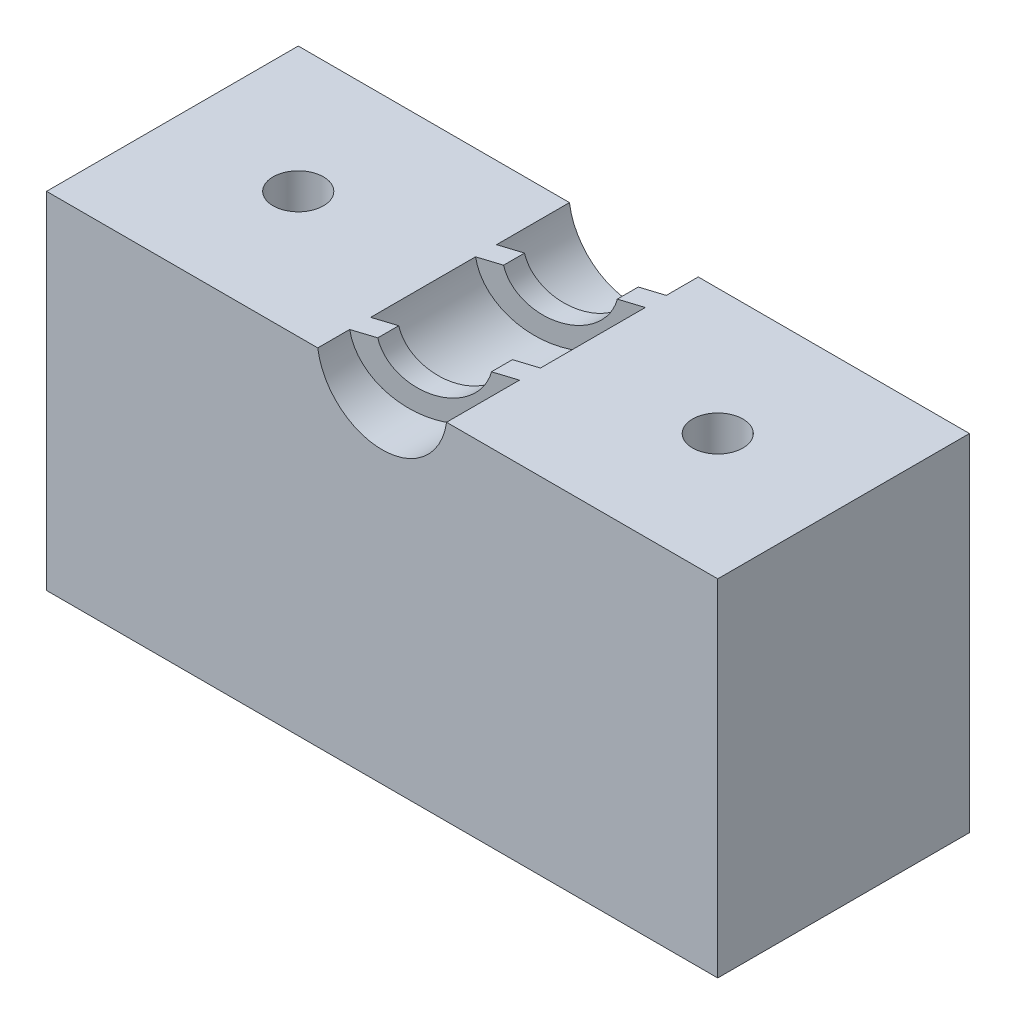
ISO-10303-21;
HEADER;
FILE_DESCRIPTION(('STEP AP214'),'2;1');
FILE_NAME('part.step','',(''),(''),'','','');
FILE_SCHEMA(('AUTOMOTIVE_DESIGN { 1 0 10303 214 1 1 1 1 }'));
ENDSEC;
DATA;
#1=APPLICATION_CONTEXT('core data for automotive mechanical design processes');
#2=APPLICATION_PROTOCOL_DEFINITION('international standard','automotive_design',2000,#1);
#3=PRODUCT_CONTEXT('',#1,'mechanical');
#4=PRODUCT('Part','Part','',(#3));
#5=PRODUCT_RELATED_PRODUCT_CATEGORY('part','',(#4));
#6=PRODUCT_DEFINITION_FORMATION('','',#4);
#7=PRODUCT_DEFINITION_CONTEXT('part definition',#1,'design');
#8=PRODUCT_DEFINITION('design','',#6,#7);
#9=PRODUCT_DEFINITION_SHAPE('','',#8);
#10=(LENGTH_UNIT() NAMED_UNIT(*) SI_UNIT(.MILLI.,.METRE.));
#11=(NAMED_UNIT(*) PLANE_ANGLE_UNIT() SI_UNIT($,.RADIAN.));
#12=(NAMED_UNIT(*) SI_UNIT($,.STERADIAN.) SOLID_ANGLE_UNIT());
#13=UNCERTAINTY_MEASURE_WITH_UNIT(LENGTH_MEASURE(1.E-05),#10,'distance_accuracy_value','');
#14=(GEOMETRIC_REPRESENTATION_CONTEXT(3) GLOBAL_UNCERTAINTY_ASSIGNED_CONTEXT((#13)) GLOBAL_UNIT_ASSIGNED_CONTEXT((#10,
#11,#12)) REPRESENTATION_CONTEXT('',''));
#15=CARTESIAN_POINT('',(0.,0.,0.));
#16=DIRECTION('',(0.,0.,1.));
#17=DIRECTION('',(1.,0.,0.));
#18=AXIS2_PLACEMENT_3D('',#15,#16,#17);
#19=CARTESIAN_POINT('',(0.,0.,3.));
#20=DIRECTION('',(0.,0.,-1.));
#21=DIRECTION('',(-1.,0.,0.));
#22=AXIS2_PLACEMENT_3D('',#19,#20,#21);
#23=CYLINDRICAL_SURFACE('',#22,1.55);
#24=CARTESIAN_POINT('',(0.,0.,-3.));
#25=DIRECTION('',(0.,0.,1.));
#26=DIRECTION('',(1.,0.,0.));
#27=AXIS2_PLACEMENT_3D('',#24,#25,#26);
#28=CIRCLE('',#27,1.55);
#29=CARTESIAN_POINT('',(-1.53514305660554,-0.214092960547071,-3.));
#30=VERTEX_POINT('',#29);
#31=CARTESIAN_POINT('',(1.53514305660554,-0.214092960547071,-3.));
#32=VERTEX_POINT('',#31);
#33=EDGE_CURVE('E235',#30,#32,#28,.T.);
#34=ORIENTED_EDGE('',*,*,#33,.F.);
#35=DIRECTION('',(0.,0.,-1.));
#36=VECTOR('',#35,1.);
#37=CARTESIAN_POINT('',(-1.53514305660554,-0.214092960547071,3.));
#38=LINE('',#37,#36);
#39=CARTESIAN_POINT('',(-1.53514305660554,-0.214092960547072,-1.26125398185195));
#40=VERTEX_POINT('',#39);
#41=EDGE_CURVE('E209',#30,#40,#38,.F.);
#42=ORIENTED_EDGE('',*,*,#41,.T.);
#43=CARTESIAN_POINT('',(0.,0.,-1.75));
#44=DIRECTION('',(-0.303367903708314,0.,-0.952873504196451));
#45=DIRECTION('',(0.952873504196451,0.,-0.303367903708314));
#46=AXIS2_PLACEMENT_3D('',#43,#44,#45);
#47=ELLIPSE('',#46,1.62665872560608,1.55);
#48=CARTESIAN_POINT('',(1.53514305660553,-0.214092960547071,-2.23874601814805));
#49=VERTEX_POINT('',#48);
#50=EDGE_CURVE('E229',#49,#40,#47,.T.);
#51=ORIENTED_EDGE('',*,*,#50,.F.);
#52=DIRECTION('',(0.,0.,-1.));
#53=VECTOR('',#52,1.);
#54=CARTESIAN_POINT('',(1.53514305660554,-0.214092960547071,3.));
#55=LINE('',#54,#53);
#56=EDGE_CURVE('E61',#32,#49,#55,.F.);
#57=ORIENTED_EDGE('',*,*,#56,.F.);
#58=EDGE_LOOP('',(#34,#42,#51,#57));
#59=FACE_BOUND('',#58,.T.);
#60=ADVANCED_FACE('F38',(#59),#23,.F.);
#61=CARTESIAN_POINT('',(0.,0.,1.75));
#62=DIRECTION('',(0.303367903708314,0.,0.952873504196451));
#63=DIRECTION('',(0.952873504196451,0.,-0.303367903708314));
#64=AXIS2_PLACEMENT_3D('',#61,#62,#63);
#65=ELLIPSE('',#64,1.62665872560608,1.55);
#66=CARTESIAN_POINT('',(-1.53514305660554,-0.214092960547072,2.23874601814805));
#67=VERTEX_POINT('',#66);
#68=CARTESIAN_POINT('',(1.53514305660553,-0.214092960547071,1.26125398185195));
#69=VERTEX_POINT('',#68);
#70=EDGE_CURVE('E152',#67,#69,#65,.T.);
#71=ORIENTED_EDGE('',*,*,#70,.F.);
#72=CARTESIAN_POINT('',(-1.53514305660554,-0.214092960547071,3.));
#73=VERTEX_POINT('',#72);
#74=EDGE_CURVE('E213',#67,#73,#38,.F.);
#75=ORIENTED_EDGE('',*,*,#74,.T.);
#76=CARTESIAN_POINT('',(0.,0.,3.));
#77=DIRECTION('',(0.,0.,1.));
#78=DIRECTION('',(1.,0.,0.));
#79=AXIS2_PLACEMENT_3D('',#76,#77,#78);
#80=CIRCLE('',#79,1.55);
#81=CARTESIAN_POINT('',(1.53514305660554,-0.214092960547071,3.));
#82=VERTEX_POINT('',#81);
#83=EDGE_CURVE('E236',#73,#82,#80,.T.);
#84=ORIENTED_EDGE('',*,*,#83,.T.);
#85=EDGE_CURVE('E201',#69,#82,#55,.F.);
#86=ORIENTED_EDGE('',*,*,#85,.F.);
#87=EDGE_LOOP('',(#71,#75,#84,#86));
#88=FACE_BOUND('',#87,.T.);
#89=ADVANCED_FACE('F281',(#88),#23,.F.);
#90=CARTESIAN_POINT('',(0.,0.,3.));
#91=DIRECTION('',(0.,0.,-1.));
#92=DIRECTION('',(-1.,0.,0.));
#93=AXIS2_PLACEMENT_3D('',#90,#91,#92);
#94=PLANE('',#93);
#95=DIRECTION('',(-1.,0.,0.));
#96=VECTOR('',#95,1.);
#97=CARTESIAN_POINT('',(0.,-0.214092960547071,3.));
#98=LINE('',#97,#96);
#99=CARTESIAN_POINT('',(-8.,-0.214092960547072,3.));
#100=VERTEX_POINT('',#99);
#101=EDGE_CURVE('E149',#73,#100,#98,.T.);
#102=ORIENTED_EDGE('',*,*,#101,.T.);
#103=DIRECTION('',(0.,-1.,0.));
#104=VECTOR('',#103,1.);
#105=CARTESIAN_POINT('',(-8.,-8.,3.));
#106=LINE('',#105,#104);
#107=CARTESIAN_POINT('',(-8.,-8.45500000000079,3.));
#108=VERTEX_POINT('',#107);
#109=EDGE_CURVE('E141',#100,#108,#106,.T.);
#110=ORIENTED_EDGE('',*,*,#109,.T.);
#111=DIRECTION('',(-1.,0.,0.));
#112=VECTOR('',#111,1.);
#113=CARTESIAN_POINT('',(8.,-8.45500000000079,3.));
#114=LINE('',#113,#112);
#115=CARTESIAN_POINT('',(8.,-8.45500000000079,3.));
#116=VERTEX_POINT('',#115);
#117=EDGE_CURVE('E146',#116,#108,#114,.T.);
#118=ORIENTED_EDGE('',*,*,#117,.F.);
#119=DIRECTION('',(0.,1.,0.));
#120=VECTOR('',#119,1.);
#121=CARTESIAN_POINT('',(8.,-8.,3.));
#122=LINE('',#121,#120);
#123=CARTESIAN_POINT('',(8.,-0.214092960547071,3.));
#124=VERTEX_POINT('',#123);
#125=EDGE_CURVE('E153',#116,#124,#122,.T.);
#126=ORIENTED_EDGE('',*,*,#125,.T.);
#127=DIRECTION('',(1.,0.,0.));
#128=VECTOR('',#127,1.);
#129=CARTESIAN_POINT('',(0.,-0.214092960547071,3.));
#130=LINE('',#129,#128);
#131=EDGE_CURVE('E179',#82,#124,#130,.T.);
#132=ORIENTED_EDGE('',*,*,#131,.F.);
#133=ORIENTED_EDGE('',*,*,#83,.F.);
#134=EDGE_LOOP('',(#102,#110,#118,#126,#132,#133));
#135=FACE_BOUND('',#134,.T.);
#136=ADVANCED_FACE('F143',(#135),#94,.F.);
#137=CARTESIAN_POINT('',(0.,0.,-3.));
#138=DIRECTION('',(0.,0.,-1.));
#139=DIRECTION('',(-1.,0.,0.));
#140=AXIS2_PLACEMENT_3D('',#137,#138,#139);
#141=PLANE('',#140);
#142=DIRECTION('',(0.,-1.,0.));
#143=VECTOR('',#142,1.);
#144=CARTESIAN_POINT('',(-8.,-8.,-3.));
#145=LINE('',#144,#143);
#146=CARTESIAN_POINT('',(-8.,-0.214092960547072,-3.));
#147=VERTEX_POINT('',#146);
#148=CARTESIAN_POINT('',(-8.,-8.45500000000079,-3.));
#149=VERTEX_POINT('',#148);
#150=EDGE_CURVE('E159',#147,#149,#145,.T.);
#151=ORIENTED_EDGE('',*,*,#150,.F.);
#152=DIRECTION('',(-1.,0.,0.));
#153=VECTOR('',#152,1.);
#154=CARTESIAN_POINT('',(0.,-0.214092960547071,-3.));
#155=LINE('',#154,#153);
#156=EDGE_CURVE('E185',#30,#147,#155,.T.);
#157=ORIENTED_EDGE('',*,*,#156,.F.);
#158=ORIENTED_EDGE('',*,*,#33,.T.);
#159=DIRECTION('',(1.,0.,0.));
#160=VECTOR('',#159,1.);
#161=CARTESIAN_POINT('',(0.,-0.214092960547071,-3.));
#162=LINE('',#161,#160);
#163=CARTESIAN_POINT('',(8.,-0.214092960547071,-3.));
#164=VERTEX_POINT('',#163);
#165=EDGE_CURVE('E182',#32,#164,#162,.T.);
#166=ORIENTED_EDGE('',*,*,#165,.T.);
#167=DIRECTION('',(0.,1.,0.));
#168=VECTOR('',#167,1.);
#169=CARTESIAN_POINT('',(8.,-8.,-3.));
#170=LINE('',#169,#168);
#171=CARTESIAN_POINT('',(8.,-8.45500000000079,-3.));
#172=VERTEX_POINT('',#171);
#173=EDGE_CURVE('E239',#172,#164,#170,.T.);
#174=ORIENTED_EDGE('',*,*,#173,.F.);
#175=DIRECTION('',(1.,0.,0.));
#176=VECTOR('',#175,1.);
#177=CARTESIAN_POINT('',(-8.,-8.45500000000079,-3.));
#178=LINE('',#177,#176);
#179=EDGE_CURVE('E164',#149,#172,#178,.T.);
#180=ORIENTED_EDGE('',*,*,#179,.F.);
#181=EDGE_LOOP('',(#151,#157,#158,#166,#174,#180));
#182=FACE_BOUND('',#181,.T.);
#183=ADVANCED_FACE('F293',(#182),#141,.T.);
#184=CARTESIAN_POINT('',(-8.,-8.,3.));
#185=DIRECTION('',(1.,0.,0.));
#186=DIRECTION('',(0.,0.,-1.));
#187=AXIS2_PLACEMENT_3D('',#184,#185,#186);
#188=PLANE('',#187);
#189=DIRECTION('',(0.,0.,1.));
#190=VECTOR('',#189,1.);
#191=CARTESIAN_POINT('',(-8.,-0.214092960547072,-3.));
#192=LINE('',#191,#190);
#193=EDGE_CURVE('E192',#147,#100,#192,.T.);
#194=ORIENTED_EDGE('',*,*,#193,.F.);
#195=ORIENTED_EDGE('',*,*,#150,.T.);
#196=DIRECTION('',(0.,0.,-1.));
#197=VECTOR('',#196,1.);
#198=CARTESIAN_POINT('',(-8.,-8.45500000000079,3.));
#199=LINE('',#198,#197);
#200=EDGE_CURVE('E156',#108,#149,#199,.T.);
#201=ORIENTED_EDGE('',*,*,#200,.F.);
#202=ORIENTED_EDGE('',*,*,#109,.F.);
#203=EDGE_LOOP('',(#194,#195,#201,#202));
#204=FACE_BOUND('',#203,.T.);
#205=ADVANCED_FACE('F157',(#204),#188,.F.);
#206=CARTESIAN_POINT('',(0.505874665567726,-11.4381719755756,1.58894385124934));
#207=DIRECTION('',(0.303367903708314,0.,0.952873504196451));
#208=DIRECTION('',(0.952873504196451,0.,-0.303367903708314));
#209=AXIS2_PLACEMENT_3D('',#206,#207,#208);
#210=PLANE('',#209);
#211=CARTESIAN_POINT('',(0.,0.,1.75));
#212=DIRECTION('',(0.303367903708314,0.,0.952873504196451));
#213=DIRECTION('',(-0.952873504196451,0.,0.303367903708314));
#214=AXIS2_PLACEMENT_3D('',#211,#212,#213);
#215=ELLIPSE('',#214,1.10193010444283,1.05);
#216=CARTESIAN_POINT('',(-1.02794173193046,-0.214092960547071,2.07726749875684));
#217=VERTEX_POINT('',#216);
#218=CARTESIAN_POINT('',(1.02794173193046,-0.214092960547071,1.42273250124316));
#219=VERTEX_POINT('',#218);
#220=EDGE_CURVE('E224',#217,#219,#215,.T.);
#221=ORIENTED_EDGE('',*,*,#220,.F.);
#222=DIRECTION('',(-0.952873504196451,0.,0.303367903708314));
#223=VECTOR('',#222,1.);
#224=CARTESIAN_POINT('',(0.505874665567725,-0.214092960547071,1.58894385124934));
#225=LINE('',#224,#223);
#226=EDGE_CURVE('E219',#217,#67,#225,.T.);
#227=ORIENTED_EDGE('',*,*,#226,.T.);
#228=ORIENTED_EDGE('',*,*,#70,.T.);
#229=DIRECTION('',(0.952873504196451,0.,-0.303367903708314));
#230=VECTOR('',#229,1.);
#231=CARTESIAN_POINT('',(0.505874665567726,-0.214092960547071,1.58894385124934));
#232=LINE('',#231,#230);
#233=EDGE_CURVE('E207',#219,#69,#232,.T.);
#234=ORIENTED_EDGE('',*,*,#233,.F.);
#235=EDGE_LOOP('',(#221,#227,#228,#234));
#236=FACE_BOUND('',#235,.T.);
#237=ADVANCED_FACE('F277',(#236),#210,.T.);
#238=CARTESIAN_POINT('',(-0.505874665567727,-11.4381719755756,-1.58894385124934));
#239=DIRECTION('',(-0.303367903708314,0.,-0.952873504196451));
#240=DIRECTION('',(-0.952873504196451,0.,0.303367903708314));
#241=AXIS2_PLACEMENT_3D('',#238,#239,#240);
#242=PLANE('',#241);
#243=ORIENTED_EDGE('',*,*,#50,.T.);
#244=DIRECTION('',(0.952873504196451,0.,-0.303367903708314));
#245=VECTOR('',#244,1.);
#246=CARTESIAN_POINT('',(-0.505874665567728,-0.214092960547071,-1.58894385124934));
#247=LINE('',#246,#245);
#248=CARTESIAN_POINT('',(-1.02794173193046,-0.214092960547071,-1.42273250124316));
#249=VERTEX_POINT('',#248);
#250=EDGE_CURVE('E12',#40,#249,#247,.T.);
#251=ORIENTED_EDGE('',*,*,#250,.T.);
#252=CARTESIAN_POINT('',(0.,0.,-1.75));
#253=DIRECTION('',(-0.303367903708314,0.,-0.952873504196451));
#254=DIRECTION('',(-0.952873504196451,0.,0.303367903708314));
#255=AXIS2_PLACEMENT_3D('',#252,#253,#254);
#256=ELLIPSE('',#255,1.10193010444283,1.05);
#257=CARTESIAN_POINT('',(1.02794173193046,-0.214092960547071,-2.07726749875684));
#258=VERTEX_POINT('',#257);
#259=EDGE_CURVE('E47',#258,#249,#256,.T.);
#260=ORIENTED_EDGE('',*,*,#259,.F.);
#261=DIRECTION('',(-0.952873504196451,0.,0.303367903708314));
#262=VECTOR('',#261,1.);
#263=CARTESIAN_POINT('',(-0.505874665567727,-0.214092960547071,-1.58894385124934));
#264=LINE('',#263,#262);
#265=EDGE_CURVE('E251',#49,#258,#264,.T.);
#266=ORIENTED_EDGE('',*,*,#265,.F.);
#267=EDGE_LOOP('',(#243,#251,#260,#266));
#268=FACE_BOUND('',#267,.T.);
#269=ADVANCED_FACE('F299',(#268),#242,.T.);
#270=CARTESIAN_POINT('',(8.,-8.,3.));
#271=DIRECTION('',(-1.,0.,0.));
#272=DIRECTION('',(0.,0.,1.));
#273=AXIS2_PLACEMENT_3D('',#270,#271,#272);
#274=PLANE('',#273);
#275=ORIENTED_EDGE('',*,*,#173,.T.);
#276=DIRECTION('',(0.,0.,1.));
#277=VECTOR('',#276,1.);
#278=CARTESIAN_POINT('',(8.,-0.214092960547071,-3.));
#279=LINE('',#278,#277);
#280=EDGE_CURVE('E194',#164,#124,#279,.T.);
#281=ORIENTED_EDGE('',*,*,#280,.T.);
#282=ORIENTED_EDGE('',*,*,#125,.F.);
#283=DIRECTION('',(0.,0.,1.));
#284=VECTOR('',#283,1.);
#285=CARTESIAN_POINT('',(8.,-8.45500000000079,-3.));
#286=LINE('',#285,#284);
#287=EDGE_CURVE('E168',#172,#116,#286,.T.);
#288=ORIENTED_EDGE('',*,*,#287,.F.);
#289=EDGE_LOOP('',(#275,#281,#282,#288));
#290=FACE_BOUND('',#289,.T.);
#291=ADVANCED_FACE('F40',(#290),#274,.F.);
#292=CARTESIAN_POINT('',(0.,0.,-3.));
#293=DIRECTION('',(0.,0.,1.));
#294=DIRECTION('',(1.,0.,0.));
#295=AXIS2_PLACEMENT_3D('',#292,#293,#294);
#296=CYLINDRICAL_SURFACE('',#295,1.05);
#297=DIRECTION('',(0.,0.,1.));
#298=VECTOR('',#297,1.);
#299=CARTESIAN_POINT('',(-1.02794173193046,-0.214092960547071,-3.));
#300=LINE('',#299,#298);
#301=CARTESIAN_POINT('',(-1.02794173193046,-0.214092960547071,1.57726749875684));
#302=VERTEX_POINT('',#301);
#303=EDGE_CURVE('E188',#302,#217,#300,.T.);
#304=ORIENTED_EDGE('',*,*,#303,.T.);
#305=ORIENTED_EDGE('',*,*,#220,.T.);
#306=DIRECTION('',(0.,0.,1.));
#307=VECTOR('',#306,1.);
#308=CARTESIAN_POINT('',(1.02794173193046,-0.214092960547071,-3.));
#309=LINE('',#308,#307);
#310=CARTESIAN_POINT('',(1.02794173193046,-0.214092960547071,0.92273250124316));
#311=VERTEX_POINT('',#310);
#312=EDGE_CURVE('E187',#311,#219,#309,.T.);
#313=ORIENTED_EDGE('',*,*,#312,.F.);
#314=CARTESIAN_POINT('',(0.,0.,1.25));
#315=DIRECTION('',(0.303367903708314,0.,0.952873504196451));
#316=DIRECTION('',(-0.952873504196451,0.,0.303367903708314));
#317=AXIS2_PLACEMENT_3D('',#314,#315,#316);
#318=ELLIPSE('',#317,1.10193010444283,1.05);
#319=EDGE_CURVE('E226',#302,#311,#318,.T.);
#320=ORIENTED_EDGE('',*,*,#319,.F.);
#321=EDGE_LOOP('',(#304,#305,#313,#320));
#322=FACE_BOUND('',#321,.T.);
#323=ADVANCED_FACE('F266',(#322),#296,.F.);
#324=CARTESIAN_POINT('',(0.,-0.214092960547071,-3.));
#325=DIRECTION('',(0.,1.,0.));
#326=DIRECTION('',(-1.,0.,0.));
#327=AXIS2_PLACEMENT_3D('',#324,#325,#326);
#328=PLANE('',#327);
#329=CARTESIAN_POINT('',(-5.,-0.214092960547072,0.));
#330=DIRECTION('',(0.,1.,0.));
#331=DIRECTION('',(-1.,0.,0.));
#332=AXIS2_PLACEMENT_3D('',#329,#330,#331);
#333=CIRCLE('',#332,0.6);
#334=CARTESIAN_POINT('',(-5.6,-0.214092960547072,0.));
#335=VERTEX_POINT('',#334);
#336=EDGE_CURVE('E42',#335,#335,#333,.T.);
#337=ORIENTED_EDGE('',*,*,#336,.F.);
#338=EDGE_LOOP('',(#337));
#339=FACE_BOUND('',#338,.T.);
#340=ORIENTED_EDGE('',*,*,#226,.F.);
#341=ORIENTED_EDGE('',*,*,#303,.F.);
#342=DIRECTION('',(-0.952873504196451,0.,0.303367903708314));
#343=VECTOR('',#342,1.);
#344=CARTESIAN_POINT('',(0.361339046834089,-0.214092960547071,1.13495989374953));
#345=LINE('',#344,#343);
#346=CARTESIAN_POINT('',(-1.53514305660554,-0.214092960547071,1.73874601814805));
#347=VERTEX_POINT('',#346);
#348=EDGE_CURVE('E217',#302,#347,#345,.T.);
#349=ORIENTED_EDGE('',*,*,#348,.T.);
#350=CARTESIAN_POINT('',(-1.53514305660554,-0.214092960547072,-0.76125398185195));
#351=VERTEX_POINT('',#350);
#352=EDGE_CURVE('E214',#351,#347,#38,.F.);
#353=ORIENTED_EDGE('',*,*,#352,.F.);
#354=DIRECTION('',(-0.952873504196451,0.,0.303367903708314));
#355=VECTOR('',#354,1.);
#356=CARTESIAN_POINT('',(-0.361339046834092,-0.214092960547071,-1.13495989374953));
#357=LINE('',#356,#355);
#358=CARTESIAN_POINT('',(-1.02794173193046,-0.214092960547071,-0.922732501243162));
#359=VERTEX_POINT('',#358);
#360=EDGE_CURVE('E212',#359,#351,#357,.T.);
#361=ORIENTED_EDGE('',*,*,#360,.F.);
#362=EDGE_CURVE('E191',#249,#359,#300,.T.);
#363=ORIENTED_EDGE('',*,*,#362,.F.);
#364=ORIENTED_EDGE('',*,*,#250,.F.);
#365=ORIENTED_EDGE('',*,*,#41,.F.);
#366=ORIENTED_EDGE('',*,*,#156,.T.);
#367=ORIENTED_EDGE('',*,*,#193,.T.);
#368=ORIENTED_EDGE('',*,*,#101,.F.);
#369=ORIENTED_EDGE('',*,*,#74,.F.);
#370=EDGE_LOOP('',(#340,#341,#349,#353,#361,#363,#364,#365,#366,#367,#368,#369));
#371=FACE_BOUND('',#370,.T.);
#372=ADVANCED_FACE('F262',(#339,#371),#328,.T.);
#373=CARTESIAN_POINT('',(0.,-0.214092960547071,-3.));
#374=DIRECTION('',(0.,-1.,0.));
#375=DIRECTION('',(1.,0.,0.));
#376=AXIS2_PLACEMENT_3D('',#373,#374,#375);
#377=PLANE('',#376);
#378=CARTESIAN_POINT('',(5.,-0.214092960547071,0.));
#379=DIRECTION('',(0.,-1.,0.));
#380=DIRECTION('',(1.,0.,0.));
#381=AXIS2_PLACEMENT_3D('',#378,#379,#380);
#382=CIRCLE('',#381,0.6);
#383=CARTESIAN_POINT('',(5.6,-0.214092960547071,0.));
#384=VERTEX_POINT('',#383);
#385=EDGE_CURVE('E163',#384,#384,#382,.T.);
#386=ORIENTED_EDGE('',*,*,#385,.T.);
#387=EDGE_LOOP('',(#386));
#388=FACE_BOUND('',#387,.T.);
#389=ORIENTED_EDGE('',*,*,#85,.T.);
#390=ORIENTED_EDGE('',*,*,#131,.T.);
#391=ORIENTED_EDGE('',*,*,#280,.F.);
#392=ORIENTED_EDGE('',*,*,#165,.F.);
#393=ORIENTED_EDGE('',*,*,#56,.T.);
#394=ORIENTED_EDGE('',*,*,#265,.T.);
#395=CARTESIAN_POINT('',(1.02794173193046,-0.214092960547071,-1.57726749875684));
#396=VERTEX_POINT('',#395);
#397=EDGE_CURVE('E55',#258,#396,#309,.T.);
#398=ORIENTED_EDGE('',*,*,#397,.T.);
#399=DIRECTION('',(0.952873504196451,0.,-0.303367903708314));
#400=VECTOR('',#399,1.);
#401=CARTESIAN_POINT('',(-0.361339046834091,-0.214092960547071,-1.13495989374953));
#402=LINE('',#401,#400);
#403=CARTESIAN_POINT('',(1.53514305660554,-0.214092960547071,-1.73874601814805));
#404=VERTEX_POINT('',#403);
#405=EDGE_CURVE('E200',#396,#404,#402,.T.);
#406=ORIENTED_EDGE('',*,*,#405,.T.);
#407=CARTESIAN_POINT('',(1.53514305660554,-0.214092960547071,0.761253981851949));
#408=VERTEX_POINT('',#407);
#409=EDGE_CURVE('E202',#404,#408,#55,.F.);
#410=ORIENTED_EDGE('',*,*,#409,.T.);
#411=DIRECTION('',(0.952873504196451,0.,-0.303367903708314));
#412=VECTOR('',#411,1.);
#413=CARTESIAN_POINT('',(0.36133904683409,-0.214092960547071,1.13495989374953));
#414=LINE('',#413,#412);
#415=EDGE_CURVE('E204',#311,#408,#414,.T.);
#416=ORIENTED_EDGE('',*,*,#415,.F.);
#417=ORIENTED_EDGE('',*,*,#312,.T.);
#418=ORIENTED_EDGE('',*,*,#233,.T.);
#419=EDGE_LOOP('',(#389,#390,#391,#392,#393,#394,#398,#406,#410,#416,#417,#418));
#420=FACE_BOUND('',#419,.T.);
#421=ADVANCED_FACE('F265',(#388,#420),#377,.F.);
#422=CARTESIAN_POINT('',(0.,0.,-1.25));
#423=DIRECTION('',(0.303367903708314,0.,0.952873504196451));
#424=DIRECTION('',(-0.952873504196451,0.,0.303367903708314));
#425=AXIS2_PLACEMENT_3D('',#422,#423,#424);
#426=ELLIPSE('',#425,1.10193010444283,1.05);
#427=EDGE_CURVE('E222',#359,#396,#426,.T.);
#428=ORIENTED_EDGE('',*,*,#427,.T.);
#429=ORIENTED_EDGE('',*,*,#397,.F.);
#430=ORIENTED_EDGE('',*,*,#259,.T.);
#431=ORIENTED_EDGE('',*,*,#362,.T.);
#432=EDGE_LOOP('',(#428,#429,#430,#431));
#433=FACE_BOUND('',#432,.T.);
#434=ADVANCED_FACE('F302',(#433),#296,.F.);
#435=CARTESIAN_POINT('',(0.36133904683409,-11.4381719755756,1.13495989374953));
#436=DIRECTION('',(0.303367903708314,0.,0.952873504196451));
#437=DIRECTION('',(0.952873504196451,0.,-0.303367903708314));
#438=AXIS2_PLACEMENT_3D('',#435,#436,#437);
#439=PLANE('',#438);
#440=ORIENTED_EDGE('',*,*,#348,.F.);
#441=ORIENTED_EDGE('',*,*,#319,.T.);
#442=ORIENTED_EDGE('',*,*,#415,.T.);
#443=CARTESIAN_POINT('',(0.,0.,1.25));
#444=DIRECTION('',(0.303367903708314,0.,0.952873504196451));
#445=DIRECTION('',(0.952873504196451,0.,-0.303367903708314));
#446=AXIS2_PLACEMENT_3D('',#443,#444,#445);
#447=ELLIPSE('',#446,1.62665872560608,1.55);
#448=EDGE_CURVE('E248',#347,#408,#447,.T.);
#449=ORIENTED_EDGE('',*,*,#448,.F.);
#450=EDGE_LOOP('',(#440,#441,#442,#449));
#451=FACE_BOUND('',#450,.T.);
#452=ADVANCED_FACE('F288',(#451),#439,.F.);
#453=CARTESIAN_POINT('',(-0.361339046834091,-11.4381719755756,-1.13495989374953));
#454=DIRECTION('',(0.303367903708314,0.,0.952873504196451));
#455=DIRECTION('',(0.952873504196451,0.,-0.303367903708314));
#456=AXIS2_PLACEMENT_3D('',#453,#454,#455);
#457=PLANE('',#456);
#458=ORIENTED_EDGE('',*,*,#427,.F.);
#459=ORIENTED_EDGE('',*,*,#360,.T.);
#460=CARTESIAN_POINT('',(0.,0.,-1.25));
#461=DIRECTION('',(0.303367903708314,0.,0.952873504196451));
#462=DIRECTION('',(0.952873504196451,0.,-0.303367903708314));
#463=AXIS2_PLACEMENT_3D('',#460,#461,#462);
#464=ELLIPSE('',#463,1.62665872560608,1.55);
#465=EDGE_CURVE('E232',#351,#404,#464,.T.);
#466=ORIENTED_EDGE('',*,*,#465,.T.);
#467=ORIENTED_EDGE('',*,*,#405,.F.);
#468=EDGE_LOOP('',(#458,#459,#466,#467));
#469=FACE_BOUND('',#468,.T.);
#470=ADVANCED_FACE('F307',(#469),#457,.T.);
#471=ORIENTED_EDGE('',*,*,#465,.F.);
#472=ORIENTED_EDGE('',*,*,#352,.T.);
#473=ORIENTED_EDGE('',*,*,#448,.T.);
#474=ORIENTED_EDGE('',*,*,#409,.F.);
#475=EDGE_LOOP('',(#471,#472,#473,#474));
#476=FACE_BOUND('',#475,.T.);
#477=ADVANCED_FACE('F290',(#476),#23,.F.);
#478=CARTESIAN_POINT('',(5.,-8.,0.));
#479=DIRECTION('',(0.,1.,0.));
#480=DIRECTION('',(0.,0.,1.));
#481=AXIS2_PLACEMENT_3D('',#478,#479,#480);
#482=CYLINDRICAL_SURFACE('',#481,0.6);
#483=ORIENTED_EDGE('',*,*,#385,.F.);
#484=EDGE_LOOP('',(#483));
#485=FACE_BOUND('',#484,.T.);
#486=CARTESIAN_POINT('',(5.,-8.45500000000079,0.));
#487=DIRECTION('',(0.,-1.,0.));
#488=DIRECTION('',(1.,0.,0.));
#489=AXIS2_PLACEMENT_3D('',#486,#487,#488);
#490=CIRCLE('',#489,0.6);
#491=CARTESIAN_POINT('',(5.6,-8.45500000000079,0.));
#492=VERTEX_POINT('',#491);
#493=EDGE_CURVE('E173',#492,#492,#490,.T.);
#494=ORIENTED_EDGE('',*,*,#493,.T.);
#495=EDGE_LOOP('',(#494));
#496=FACE_BOUND('',#495,.T.);
#497=ADVANCED_FACE('F314',(#485,#496),#482,.F.);
#498=CARTESIAN_POINT('',(-5.,-8.,0.));
#499=DIRECTION('',(0.,1.,0.));
#500=DIRECTION('',(0.,0.,1.));
#501=AXIS2_PLACEMENT_3D('',#498,#499,#500);
#502=CYLINDRICAL_SURFACE('',#501,0.6);
#503=ORIENTED_EDGE('',*,*,#336,.T.);
#504=EDGE_LOOP('',(#503));
#505=FACE_BOUND('',#504,.T.);
#506=CARTESIAN_POINT('',(-5.,-8.45500000000079,0.));
#507=DIRECTION('',(0.,-1.,0.));
#508=DIRECTION('',(1.,0.,0.));
#509=AXIS2_PLACEMENT_3D('',#506,#507,#508);
#510=CIRCLE('',#509,0.6);
#511=CARTESIAN_POINT('',(-4.4,-8.45500000000079,0.));
#512=VERTEX_POINT('',#511);
#513=EDGE_CURVE('E169',#512,#512,#510,.T.);
#514=ORIENTED_EDGE('',*,*,#513,.T.);
#515=EDGE_LOOP('',(#514));
#516=FACE_BOUND('',#515,.T.);
#517=ADVANCED_FACE('F259',(#505,#516),#502,.F.);
#518=CARTESIAN_POINT('',(27.7477781678249,-8.45500000000078,-11.));
#519=DIRECTION('',(0.,-1.,0.));
#520=DIRECTION('',(0.,0.,-1.));
#521=AXIS2_PLACEMENT_3D('',#518,#519,#520);
#522=PLANE('',#521);
#523=ORIENTED_EDGE('',*,*,#493,.F.);
#524=EDGE_LOOP('',(#523));
#525=FACE_BOUND('',#524,.T.);
#526=ORIENTED_EDGE('',*,*,#513,.F.);
#527=EDGE_LOOP('',(#526));
#528=FACE_BOUND('',#527,.T.);
#529=ORIENTED_EDGE('',*,*,#117,.T.);
#530=ORIENTED_EDGE('',*,*,#200,.T.);
#531=ORIENTED_EDGE('',*,*,#179,.T.);
#532=ORIENTED_EDGE('',*,*,#287,.T.);
#533=EDGE_LOOP('',(#529,#530,#531,#532));
#534=FACE_BOUND('',#533,.T.);
#535=ADVANCED_FACE('F166',(#525,#528,#534),#522,.T.);
#536=CLOSED_SHELL('',(#60,#89,#136,#183,#205,#237,#269,#291,#323,#372,#421,#434,#452,#470,#477,
#497,#517,#535));
#537=MANIFOLD_SOLID_BREP('B2',#536);
#538=ADVANCED_BREP_SHAPE_REPRESENTATION('',(#18,#537),#14);
#539=SHAPE_DEFINITION_REPRESENTATION(#9,#538);
ENDSEC;
END-ISO-10303-21;
